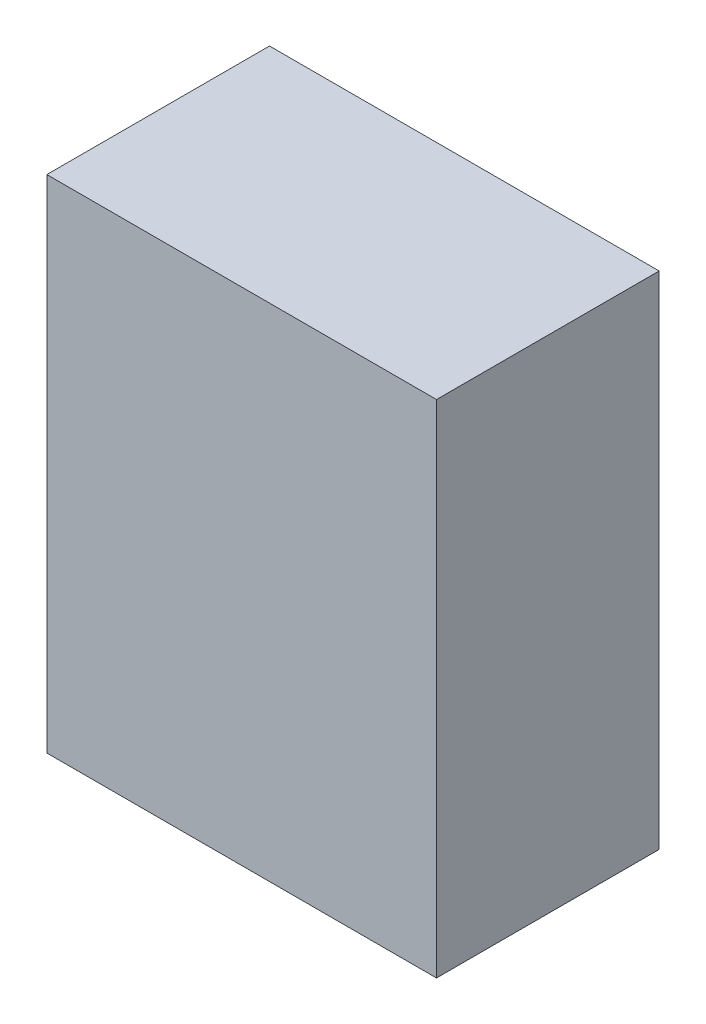
ISO-10303-21;
HEADER;
FILE_DESCRIPTION(('STEP AP214'),'2;1');
FILE_NAME('part.step','',(''),(''),'','','');
FILE_SCHEMA(('AUTOMOTIVE_DESIGN { 1 0 10303 214 1 1 1 1 }'));
ENDSEC;
DATA;
#1=APPLICATION_CONTEXT('core data for automotive mechanical design processes');
#2=APPLICATION_PROTOCOL_DEFINITION('international standard','automotive_design',2000,#1);
#3=PRODUCT_CONTEXT('',#1,'mechanical');
#4=PRODUCT('Part','Part','',(#3));
#5=PRODUCT_RELATED_PRODUCT_CATEGORY('part','',(#4));
#6=PRODUCT_DEFINITION_FORMATION('','',#4);
#7=PRODUCT_DEFINITION_CONTEXT('part definition',#1,'design');
#8=PRODUCT_DEFINITION('design','',#6,#7);
#9=PRODUCT_DEFINITION_SHAPE('','',#8);
#10=(LENGTH_UNIT() NAMED_UNIT(*) SI_UNIT(.MILLI.,.METRE.));
#11=(NAMED_UNIT(*) PLANE_ANGLE_UNIT() SI_UNIT($,.RADIAN.));
#12=(NAMED_UNIT(*) SI_UNIT($,.STERADIAN.) SOLID_ANGLE_UNIT());
#13=UNCERTAINTY_MEASURE_WITH_UNIT(LENGTH_MEASURE(1.E-05),#10,'distance_accuracy_value','');
#14=(GEOMETRIC_REPRESENTATION_CONTEXT(3) GLOBAL_UNCERTAINTY_ASSIGNED_CONTEXT((#13)) GLOBAL_UNIT_ASSIGNED_CONTEXT((#10,
#11,#12)) REPRESENTATION_CONTEXT('',''));
#15=CARTESIAN_POINT('',(0.,0.,0.));
#16=DIRECTION('',(0.,0.,1.));
#17=DIRECTION('',(1.,0.,0.));
#18=AXIS2_PLACEMENT_3D('',#15,#16,#17);
#19=CARTESIAN_POINT('',(35.,45.,40.));
#20=DIRECTION('',(-1.,0.,0.));
#21=DIRECTION('',(0.,-1.,0.));
#22=AXIS2_PLACEMENT_3D('',#19,#20,#21);
#23=PLANE('',#22);
#24=DIRECTION('',(0.,1.,0.));
#25=VECTOR('',#24,1.);
#26=CARTESIAN_POINT('',(35.,45.,0.));
#27=LINE('',#26,#25);
#28=CARTESIAN_POINT('',(35.,-45.,0.));
#29=VERTEX_POINT('',#28);
#30=CARTESIAN_POINT('',(35.,45.,0.));
#31=VERTEX_POINT('',#30);
#32=EDGE_CURVE('E98',#29,#31,#27,.T.);
#33=ORIENTED_EDGE('',*,*,#32,.T.);
#34=DIRECTION('',(0.,0.,-1.));
#35=VECTOR('',#34,1.);
#36=CARTESIAN_POINT('',(35.,45.,40.));
#37=LINE('',#36,#35);
#38=CARTESIAN_POINT('',(35.,45.,40.));
#39=VERTEX_POINT('',#38);
#40=EDGE_CURVE('E11',#39,#31,#37,.T.);
#41=ORIENTED_EDGE('',*,*,#40,.F.);
#42=DIRECTION('',(0.,1.,0.));
#43=VECTOR('',#42,1.);
#44=CARTESIAN_POINT('',(35.,45.,40.));
#45=LINE('',#44,#43);
#46=CARTESIAN_POINT('',(35.,-45.,40.));
#47=VERTEX_POINT('',#46);
#48=EDGE_CURVE('E86',#47,#39,#45,.T.);
#49=ORIENTED_EDGE('',*,*,#48,.F.);
#50=DIRECTION('',(0.,0.,-1.));
#51=VECTOR('',#50,1.);
#52=CARTESIAN_POINT('',(35.,-45.,40.));
#53=LINE('',#52,#51);
#54=EDGE_CURVE('E94',#47,#29,#53,.T.);
#55=ORIENTED_EDGE('',*,*,#54,.T.);
#56=EDGE_LOOP('',(#33,#41,#49,#55));
#57=FACE_BOUND('',#56,.T.);
#58=ADVANCED_FACE('F35',(#57),#23,.F.);
#59=CARTESIAN_POINT('',(-35.,45.,40.));
#60=DIRECTION('',(0.,-1.,0.));
#61=DIRECTION('',(0.,0.,-1.));
#62=AXIS2_PLACEMENT_3D('',#59,#60,#61);
#63=PLANE('',#62);
#64=DIRECTION('',(-1.,0.,0.));
#65=VECTOR('',#64,1.);
#66=CARTESIAN_POINT('',(-35.,45.,0.));
#67=LINE('',#66,#65);
#68=CARTESIAN_POINT('',(-35.,45.,0.));
#69=VERTEX_POINT('',#68);
#70=EDGE_CURVE('E90',#31,#69,#67,.T.);
#71=ORIENTED_EDGE('',*,*,#70,.T.);
#72=DIRECTION('',(0.,0.,-1.));
#73=VECTOR('',#72,1.);
#74=CARTESIAN_POINT('',(-35.,45.,40.));
#75=LINE('',#74,#73);
#76=CARTESIAN_POINT('',(-35.,45.,40.));
#77=VERTEX_POINT('',#76);
#78=EDGE_CURVE('E43',#77,#69,#75,.T.);
#79=ORIENTED_EDGE('',*,*,#78,.F.);
#80=DIRECTION('',(-1.,0.,0.));
#81=VECTOR('',#80,1.);
#82=CARTESIAN_POINT('',(-35.,45.,40.));
#83=LINE('',#82,#81);
#84=EDGE_CURVE('E81',#39,#77,#83,.T.);
#85=ORIENTED_EDGE('',*,*,#84,.F.);
#86=ORIENTED_EDGE('',*,*,#40,.T.);
#87=EDGE_LOOP('',(#71,#79,#85,#86));
#88=FACE_BOUND('',#87,.T.);
#89=ADVANCED_FACE('F89',(#88),#63,.F.);
#90=CARTESIAN_POINT('',(-35.,45.,40.));
#91=DIRECTION('',(1.,0.,0.));
#92=DIRECTION('',(0.,1.,0.));
#93=AXIS2_PLACEMENT_3D('',#90,#91,#92);
#94=PLANE('',#93);
#95=DIRECTION('',(0.,-1.,0.));
#96=VECTOR('',#95,1.);
#97=CARTESIAN_POINT('',(-35.,45.,0.));
#98=LINE('',#97,#96);
#99=CARTESIAN_POINT('',(-35.,-45.,0.));
#100=VERTEX_POINT('',#99);
#101=EDGE_CURVE('E68',#69,#100,#98,.T.);
#102=ORIENTED_EDGE('',*,*,#101,.T.);
#103=DIRECTION('',(0.,0.,-1.));
#104=VECTOR('',#103,1.);
#105=CARTESIAN_POINT('',(-35.,-45.,40.));
#106=LINE('',#105,#104);
#107=CARTESIAN_POINT('',(-35.,-45.,40.));
#108=VERTEX_POINT('',#107);
#109=EDGE_CURVE('E91',#108,#100,#106,.T.);
#110=ORIENTED_EDGE('',*,*,#109,.F.);
#111=DIRECTION('',(0.,-1.,0.));
#112=VECTOR('',#111,1.);
#113=CARTESIAN_POINT('',(-35.,45.,40.));
#114=LINE('',#113,#112);
#115=EDGE_CURVE('E84',#77,#108,#114,.T.);
#116=ORIENTED_EDGE('',*,*,#115,.F.);
#117=ORIENTED_EDGE('',*,*,#78,.T.);
#118=EDGE_LOOP('',(#102,#110,#116,#117));
#119=FACE_BOUND('',#118,.T.);
#120=ADVANCED_FACE('F92',(#119),#94,.F.);
#121=CARTESIAN_POINT('',(-35.,-45.,40.));
#122=DIRECTION('',(0.,1.,0.));
#123=DIRECTION('',(0.,0.,1.));
#124=AXIS2_PLACEMENT_3D('',#121,#122,#123);
#125=PLANE('',#124);
#126=DIRECTION('',(1.,0.,0.));
#127=VECTOR('',#126,1.);
#128=CARTESIAN_POINT('',(-35.,-45.,0.));
#129=LINE('',#128,#127);
#130=EDGE_CURVE('E74',#100,#29,#129,.T.);
#131=ORIENTED_EDGE('',*,*,#130,.T.);
#132=ORIENTED_EDGE('',*,*,#54,.F.);
#133=DIRECTION('',(1.,0.,0.));
#134=VECTOR('',#133,1.);
#135=CARTESIAN_POINT('',(-35.,-45.,40.));
#136=LINE('',#135,#134);
#137=EDGE_CURVE('E51',#108,#47,#136,.T.);
#138=ORIENTED_EDGE('',*,*,#137,.F.);
#139=ORIENTED_EDGE('',*,*,#109,.T.);
#140=EDGE_LOOP('',(#131,#132,#138,#139));
#141=FACE_BOUND('',#140,.T.);
#142=ADVANCED_FACE('F105',(#141),#125,.F.);
#143=CARTESIAN_POINT('',(0.,0.,40.));
#144=DIRECTION('',(0.,0.,1.));
#145=DIRECTION('',(1.,0.,0.));
#146=AXIS2_PLACEMENT_3D('',#143,#144,#145);
#147=PLANE('',#146);
#148=ORIENTED_EDGE('',*,*,#48,.T.);
#149=ORIENTED_EDGE('',*,*,#84,.T.);
#150=ORIENTED_EDGE('',*,*,#115,.T.);
#151=ORIENTED_EDGE('',*,*,#137,.T.);
#152=EDGE_LOOP('',(#148,#149,#150,#151));
#153=FACE_BOUND('',#152,.T.);
#154=ADVANCED_FACE('F82',(#153),#147,.T.);
#155=CARTESIAN_POINT('',(0.,0.,0.));
#156=DIRECTION('',(0.,0.,1.));
#157=DIRECTION('',(1.,0.,0.));
#158=AXIS2_PLACEMENT_3D('',#155,#156,#157);
#159=PLANE('',#158);
#160=ORIENTED_EDGE('',*,*,#32,.F.);
#161=ORIENTED_EDGE('',*,*,#130,.F.);
#162=ORIENTED_EDGE('',*,*,#101,.F.);
#163=ORIENTED_EDGE('',*,*,#70,.F.);
#164=EDGE_LOOP('',(#160,#161,#162,#163));
#165=FACE_BOUND('',#164,.T.);
#166=ADVANCED_FACE('F108',(#165),#159,.F.);
#167=CLOSED_SHELL('',(#58,#89,#120,#142,#154,#166));
#168=MANIFOLD_SOLID_BREP('B2',#167);
#169=ADVANCED_BREP_SHAPE_REPRESENTATION('',(#18,#168),#14);
#170=SHAPE_DEFINITION_REPRESENTATION(#9,#169);
ENDSEC;
END-ISO-10303-21;
